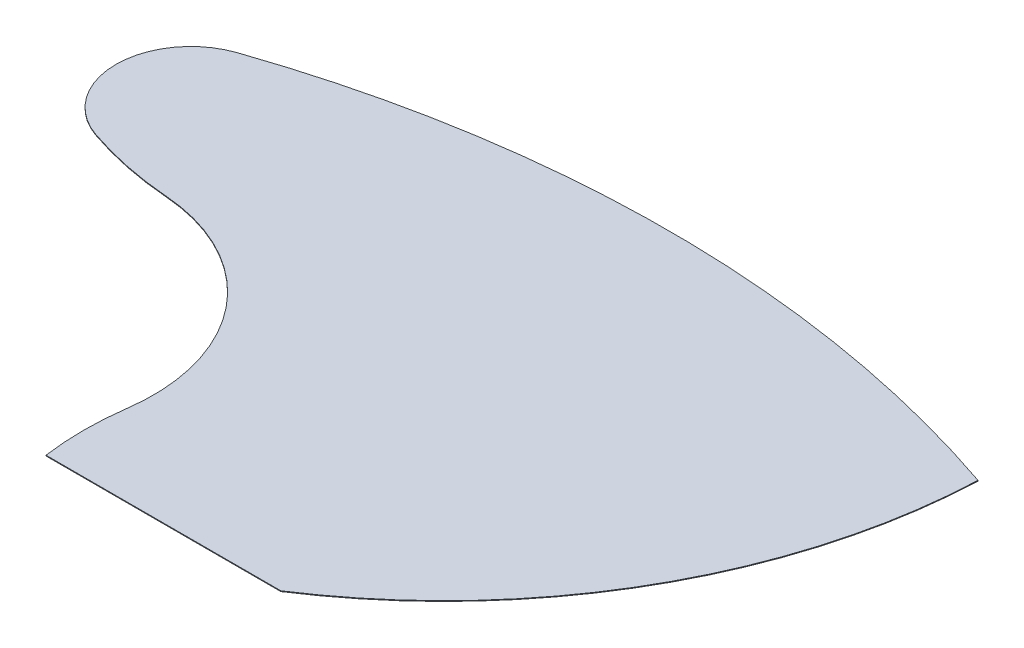
ISO-10303-21;
HEADER;
FILE_DESCRIPTION(('STEP AP214'),'2;1');
FILE_NAME('part.step','',(''),(''),'','','');
FILE_SCHEMA(('AUTOMOTIVE_DESIGN { 1 0 10303 214 1 1 1 1 }'));
ENDSEC;
DATA;
#1=APPLICATION_CONTEXT('core data for automotive mechanical design processes');
#2=APPLICATION_PROTOCOL_DEFINITION('international standard','automotive_design',2000,#1);
#3=PRODUCT_CONTEXT('',#1,'mechanical');
#4=PRODUCT('Part','Part','',(#3));
#5=PRODUCT_RELATED_PRODUCT_CATEGORY('part','',(#4));
#6=PRODUCT_DEFINITION_FORMATION('','',#4);
#7=PRODUCT_DEFINITION_CONTEXT('part definition',#1,'design');
#8=PRODUCT_DEFINITION('design','',#6,#7);
#9=PRODUCT_DEFINITION_SHAPE('','',#8);
#10=(LENGTH_UNIT() NAMED_UNIT(*) SI_UNIT(.MILLI.,.METRE.));
#11=(NAMED_UNIT(*) PLANE_ANGLE_UNIT() SI_UNIT($,.RADIAN.));
#12=(NAMED_UNIT(*) SI_UNIT($,.STERADIAN.) SOLID_ANGLE_UNIT());
#13=UNCERTAINTY_MEASURE_WITH_UNIT(LENGTH_MEASURE(1.E-05),#10,'distance_accuracy_value','');
#14=(GEOMETRIC_REPRESENTATION_CONTEXT(3) GLOBAL_UNCERTAINTY_ASSIGNED_CONTEXT((#13)) GLOBAL_UNIT_ASSIGNED_CONTEXT((#10,
#11,#12)) REPRESENTATION_CONTEXT('',''));
#15=CARTESIAN_POINT('',(0.,0.,0.));
#16=DIRECTION('',(0.,0.,1.));
#17=DIRECTION('',(1.,0.,0.));
#18=AXIS2_PLACEMENT_3D('',#15,#16,#17);
#19=CARTESIAN_POINT('',(158.730655830368,0.2,-18.2172793213948));
#20=DIRECTION('',(0.,-1.,0.));
#21=DIRECTION('',(0.,0.,-1.));
#22=AXIS2_PLACEMENT_3D('',#19,#20,#21);
#23=CYLINDRICAL_SURFACE('',#22,82.49);
#24=CARTESIAN_POINT('',(158.730655830368,0.,-18.2172793213948));
#25=DIRECTION('',(0.,1.,0.));
#26=DIRECTION('',(0.,0.,1.));
#27=AXIS2_PLACEMENT_3D('',#24,#25,#26);
#28=CIRCLE('',#27,82.49);
#29=CARTESIAN_POINT('',(77.0118111562556,0.,-29.4703022542895));
#30=VERTEX_POINT('',#29);
#31=CARTESIAN_POINT('',(77.0118111562556,0.,-6.96425638850026));
#32=VERTEX_POINT('',#31);
#33=EDGE_CURVE('E129',#30,#32,#28,.T.);
#34=ORIENTED_EDGE('',*,*,#33,.T.);
#35=DIRECTION('',(0.,-1.,0.));
#36=VECTOR('',#35,1.);
#37=CARTESIAN_POINT('',(77.0118111562556,0.2,-6.96425638850026));
#38=LINE('',#37,#36);
#39=CARTESIAN_POINT('',(77.0118111562556,0.2,-6.96425638850026));
#40=VERTEX_POINT('',#39);
#41=EDGE_CURVE('E11',#40,#32,#38,.T.);
#42=ORIENTED_EDGE('',*,*,#41,.F.);
#43=CARTESIAN_POINT('',(158.730655830368,0.2,-18.2172793213948));
#44=DIRECTION('',(0.,1.,0.));
#45=DIRECTION('',(0.,0.,1.));
#46=AXIS2_PLACEMENT_3D('',#43,#44,#45);
#47=CIRCLE('',#46,82.49);
#48=CARTESIAN_POINT('',(77.0118111562556,0.2,-29.4703022542895));
#49=VERTEX_POINT('',#48);
#50=EDGE_CURVE('E141',#49,#40,#47,.T.);
#51=ORIENTED_EDGE('',*,*,#50,.F.);
#52=DIRECTION('',(0.,-1.,0.));
#53=VECTOR('',#52,1.);
#54=CARTESIAN_POINT('',(77.0118111562556,0.2,-29.4703022542895));
#55=LINE('',#54,#53);
#56=EDGE_CURVE('E125',#49,#30,#55,.T.);
#57=ORIENTED_EDGE('',*,*,#56,.T.);
#58=EDGE_LOOP('',(#34,#42,#51,#57));
#59=FACE_BOUND('',#58,.T.);
#60=ADVANCED_FACE('F39',(#59),#23,.T.);
#61=CARTESIAN_POINT('',(77.0118111562556,0.2,-6.96425638850026));
#62=DIRECTION('',(0.,0.,-1.));
#63=DIRECTION('',(-1.,0.,0.));
#64=AXIS2_PLACEMENT_3D('',#61,#62,#63);
#65=PLANE('',#64);
#66=DIRECTION('',(1.,0.,0.));
#67=VECTOR('',#66,1.);
#68=CARTESIAN_POINT('',(77.0118111562556,0.,-6.96425638850026));
#69=LINE('',#68,#67);
#70=CARTESIAN_POINT('',(142.011811156256,0.,-6.96425638850026));
#71=VERTEX_POINT('',#70);
#72=EDGE_CURVE('E132',#32,#71,#69,.T.);
#73=ORIENTED_EDGE('',*,*,#72,.T.);
#74=DIRECTION('',(0.,-1.,0.));
#75=VECTOR('',#74,1.);
#76=CARTESIAN_POINT('',(142.011811156256,0.2,-6.96425638850026));
#77=LINE('',#76,#75);
#78=CARTESIAN_POINT('',(142.011811156256,0.2,-6.96425638850026));
#79=VERTEX_POINT('',#78);
#80=EDGE_CURVE('E47',#79,#71,#77,.T.);
#81=ORIENTED_EDGE('',*,*,#80,.F.);
#82=DIRECTION('',(1.,0.,0.));
#83=VECTOR('',#82,1.);
#84=CARTESIAN_POINT('',(77.0118111562556,0.2,-6.96425638850026));
#85=LINE('',#84,#83);
#86=EDGE_CURVE('E95',#40,#79,#85,.T.);
#87=ORIENTED_EDGE('',*,*,#86,.F.);
#88=ORIENTED_EDGE('',*,*,#41,.T.);
#89=EDGE_LOOP('',(#73,#81,#87,#88));
#90=FACE_BOUND('',#89,.T.);
#91=ADVANCED_FACE('F166',(#90),#65,.F.);
#92=CARTESIAN_POINT('',(57.9997865278131,0.2,-136.197066919843));
#93=DIRECTION('',(0.,-1.,0.));
#94=DIRECTION('',(0.,0.,-1.));
#95=AXIS2_PLACEMENT_3D('',#92,#93,#94);
#96=CYLINDRICAL_SURFACE('',#95,154.14);
#97=CARTESIAN_POINT('',(57.9997865278131,0.,-136.197066919843));
#98=DIRECTION('',(0.,1.,0.));
#99=DIRECTION('',(0.,0.,1.));
#100=AXIS2_PLACEMENT_3D('',#97,#98,#99);
#101=CIRCLE('',#100,154.14);
#102=CARTESIAN_POINT('',(212.011811156255,0.,-129.917268368291));
#103=VERTEX_POINT('',#102);
#104=EDGE_CURVE('E134',#71,#103,#101,.T.);
#105=ORIENTED_EDGE('',*,*,#104,.T.);
#106=DIRECTION('',(0.,-1.,0.));
#107=VECTOR('',#106,1.);
#108=CARTESIAN_POINT('',(212.011811156255,0.2,-129.917268368291));
#109=LINE('',#108,#107);
#110=CARTESIAN_POINT('',(212.011811156255,0.2,-129.917268368291));
#111=VERTEX_POINT('',#110);
#112=EDGE_CURVE('E145',#111,#103,#109,.T.);
#113=ORIENTED_EDGE('',*,*,#112,.F.);
#114=CARTESIAN_POINT('',(57.9997865278131,0.2,-136.197066919843));
#115=DIRECTION('',(0.,1.,0.));
#116=DIRECTION('',(0.,0.,1.));
#117=AXIS2_PLACEMENT_3D('',#114,#115,#116);
#118=CIRCLE('',#117,154.14);
#119=EDGE_CURVE('E153',#79,#111,#118,.T.);
#120=ORIENTED_EDGE('',*,*,#119,.F.);
#121=ORIENTED_EDGE('',*,*,#80,.T.);
#122=EDGE_LOOP('',(#105,#113,#120,#121));
#123=FACE_BOUND('',#122,.T.);
#124=ADVANCED_FACE('F151',(#123),#96,.T.);
#125=CARTESIAN_POINT('',(109.511811156256,0.2,169.714848089125));
#126=DIRECTION('',(0.,-1.,0.));
#127=DIRECTION('',(0.,0.,-1.));
#128=AXIS2_PLACEMENT_3D('',#125,#126,#127);
#129=CYLINDRICAL_SURFACE('',#128,316.679104477624);
#130=CARTESIAN_POINT('',(109.511811156256,0.,169.714848089125));
#131=DIRECTION('',(0.,1.,0.));
#132=DIRECTION('',(0.,0.,-1.));
#133=AXIS2_PLACEMENT_3D('',#130,#131,#132);
#134=CIRCLE('',#133,316.679104477624);
#135=CARTESIAN_POINT('',(7.01181115625533,0.,-129.91726836829));
#136=VERTEX_POINT('',#135);
#137=EDGE_CURVE('E136',#103,#136,#134,.T.);
#138=ORIENTED_EDGE('',*,*,#137,.T.);
#139=DIRECTION('',(0.,-1.,0.));
#140=VECTOR('',#139,1.);
#141=CARTESIAN_POINT('',(7.01181115625533,0.2,-129.91726836829));
#142=LINE('',#141,#140);
#143=CARTESIAN_POINT('',(7.01181115625533,0.2,-129.91726836829));
#144=VERTEX_POINT('',#143);
#145=EDGE_CURVE('E120',#144,#136,#142,.T.);
#146=ORIENTED_EDGE('',*,*,#145,.F.);
#147=CARTESIAN_POINT('',(109.511811156256,0.2,169.714848089125));
#148=DIRECTION('',(0.,1.,0.));
#149=DIRECTION('',(0.,0.,-1.));
#150=AXIS2_PLACEMENT_3D('',#147,#148,#149);
#151=CIRCLE('',#150,316.679104477624);
#152=EDGE_CURVE('E111',#111,#144,#151,.T.);
#153=ORIENTED_EDGE('',*,*,#152,.F.);
#154=ORIENTED_EDGE('',*,*,#112,.T.);
#155=EDGE_LOOP('',(#138,#146,#153,#154));
#156=FACE_BOUND('',#155,.T.);
#157=ADVANCED_FACE('F159',(#156),#129,.T.);
#158=CARTESIAN_POINT('',(13.7118111562555,0.2,-110.331559292538));
#159=DIRECTION('',(0.,-1.,0.));
#160=DIRECTION('',(0.,0.,-1.));
#161=AXIS2_PLACEMENT_3D('',#158,#159,#160);
#162=CYLINDRICAL_SURFACE('',#161,20.7);
#163=CARTESIAN_POINT('',(13.7118111562555,0.,-110.331559292538));
#164=DIRECTION('',(0.,1.,0.));
#165=DIRECTION('',(0.,0.,1.));
#166=AXIS2_PLACEMENT_3D('',#163,#164,#165);
#167=CIRCLE('',#166,20.7);
#168=CARTESIAN_POINT('',(7.01181115625551,0.,-90.7458502167862));
#169=VERTEX_POINT('',#168);
#170=EDGE_CURVE('E119',#136,#169,#167,.T.);
#171=ORIENTED_EDGE('',*,*,#170,.T.);
#172=DIRECTION('',(0.,-1.,0.));
#173=VECTOR('',#172,1.);
#174=CARTESIAN_POINT('',(7.01181115625551,0.2,-90.7458502167862));
#175=LINE('',#174,#173);
#176=CARTESIAN_POINT('',(7.01181115625551,0.2,-90.7458502167862));
#177=VERTEX_POINT('',#176);
#178=EDGE_CURVE('E116',#177,#169,#175,.T.);
#179=ORIENTED_EDGE('',*,*,#178,.F.);
#180=CARTESIAN_POINT('',(13.7118111562555,0.2,-110.331559292538));
#181=DIRECTION('',(0.,1.,0.));
#182=DIRECTION('',(0.,0.,1.));
#183=AXIS2_PLACEMENT_3D('',#180,#181,#182);
#184=CIRCLE('',#183,20.7);
#185=EDGE_CURVE('E105',#144,#177,#184,.T.);
#186=ORIENTED_EDGE('',*,*,#185,.F.);
#187=ORIENTED_EDGE('',*,*,#145,.T.);
#188=EDGE_LOOP('',(#171,#179,#186,#187));
#189=FACE_BOUND('',#188,.T.);
#190=ADVANCED_FACE('F117',(#189),#162,.T.);
#191=CARTESIAN_POINT('',(39.2818594654343,0.2,-185.07895141739));
#192=DIRECTION('',(0.,-1.,0.));
#193=DIRECTION('',(0.,0.,-1.));
#194=AXIS2_PLACEMENT_3D('',#191,#192,#193);
#195=CYLINDRICAL_SURFACE('',#194,99.6999999999995);
#196=CARTESIAN_POINT('',(39.2818594654343,0.,-185.07895141739));
#197=DIRECTION('',(0.,1.,0.));
#198=DIRECTION('',(0.,0.,1.));
#199=AXIS2_PLACEMENT_3D('',#196,#197,#198);
#200=CIRCLE('',#199,99.6999999999995);
#201=CARTESIAN_POINT('',(31.6770956043986,0.,-85.6694067719291));
#202=VERTEX_POINT('',#201);
#203=EDGE_CURVE('E81',#169,#202,#200,.T.);
#204=ORIENTED_EDGE('',*,*,#203,.T.);
#205=DIRECTION('',(0.,-1.,0.));
#206=VECTOR('',#205,1.);
#207=CARTESIAN_POINT('',(31.6770956043986,0.2,-85.6694067719291));
#208=LINE('',#207,#206);
#209=CARTESIAN_POINT('',(31.6770956043986,0.2,-85.6694067719291));
#210=VERTEX_POINT('',#209);
#211=EDGE_CURVE('E121',#210,#202,#208,.T.);
#212=ORIENTED_EDGE('',*,*,#211,.F.);
#213=CARTESIAN_POINT('',(39.2818594654343,0.2,-185.07895141739));
#214=DIRECTION('',(0.,1.,0.));
#215=DIRECTION('',(0.,0.,1.));
#216=AXIS2_PLACEMENT_3D('',#213,#214,#215);
#217=CIRCLE('',#216,99.6999999999995);
#218=EDGE_CURVE('E109',#177,#210,#217,.T.);
#219=ORIENTED_EDGE('',*,*,#218,.F.);
#220=ORIENTED_EDGE('',*,*,#178,.T.);
#221=EDGE_LOOP('',(#204,#212,#219,#220));
#222=FACE_BOUND('',#221,.T.);
#223=ADVANCED_FACE('F123',(#222),#195,.T.);
#224=CARTESIAN_POINT('',(27.8953083202452,0.2,-36.2338478599741));
#225=DIRECTION('',(0.,-1.,0.));
#226=DIRECTION('',(0.,0.,-1.));
#227=AXIS2_PLACEMENT_3D('',#224,#225,#226);
#228=CYLINDRICAL_SURFACE('',#227,49.58);
#229=CARTESIAN_POINT('',(27.8953083202452,0.,-36.2338478599741));
#230=DIRECTION('',(0.,-1.,0.));
#231=DIRECTION('',(0.,0.,1.));
#232=AXIS2_PLACEMENT_3D('',#229,#230,#231);
#233=CIRCLE('',#232,49.58);
#234=EDGE_CURVE('E87',#202,#30,#233,.T.);
#235=ORIENTED_EDGE('',*,*,#234,.T.);
#236=ORIENTED_EDGE('',*,*,#56,.F.);
#237=CARTESIAN_POINT('',(27.8953083202452,0.2,-36.2338478599741));
#238=DIRECTION('',(0.,-1.,0.));
#239=DIRECTION('',(0.,0.,1.));
#240=AXIS2_PLACEMENT_3D('',#237,#238,#239);
#241=CIRCLE('',#240,49.58);
#242=EDGE_CURVE('E55',#210,#49,#241,.T.);
#243=ORIENTED_EDGE('',*,*,#242,.F.);
#244=ORIENTED_EDGE('',*,*,#211,.T.);
#245=EDGE_LOOP('',(#235,#236,#243,#244));
#246=FACE_BOUND('',#245,.T.);
#247=ADVANCED_FACE('F180',(#246),#228,.F.);
#248=CARTESIAN_POINT('',(158.730655830368,0.2,-18.2172793213948));
#249=DIRECTION('',(0.,1.,0.));
#250=DIRECTION('',(0.,0.,1.));
#251=AXIS2_PLACEMENT_3D('',#248,#249,#250);
#252=PLANE('',#251);
#253=ORIENTED_EDGE('',*,*,#50,.T.);
#254=ORIENTED_EDGE('',*,*,#86,.T.);
#255=ORIENTED_EDGE('',*,*,#119,.T.);
#256=ORIENTED_EDGE('',*,*,#152,.T.);
#257=ORIENTED_EDGE('',*,*,#185,.T.);
#258=ORIENTED_EDGE('',*,*,#218,.T.);
#259=ORIENTED_EDGE('',*,*,#242,.T.);
#260=EDGE_LOOP('',(#253,#254,#255,#256,#257,#258,#259));
#261=FACE_BOUND('',#260,.T.);
#262=ADVANCED_FACE('F107',(#261),#252,.T.);
#263=CARTESIAN_POINT('',(158.730655830368,0.,-18.2172793213948));
#264=DIRECTION('',(0.,1.,0.));
#265=DIRECTION('',(0.,0.,1.));
#266=AXIS2_PLACEMENT_3D('',#263,#264,#265);
#267=PLANE('',#266);
#268=ORIENTED_EDGE('',*,*,#33,.F.);
#269=ORIENTED_EDGE('',*,*,#234,.F.);
#270=ORIENTED_EDGE('',*,*,#203,.F.);
#271=ORIENTED_EDGE('',*,*,#170,.F.);
#272=ORIENTED_EDGE('',*,*,#137,.F.);
#273=ORIENTED_EDGE('',*,*,#104,.F.);
#274=ORIENTED_EDGE('',*,*,#72,.F.);
#275=EDGE_LOOP('',(#268,#269,#270,#271,#272,#273,#274));
#276=FACE_BOUND('',#275,.T.);
#277=ADVANCED_FACE('F157',(#276),#267,.F.);
#278=CLOSED_SHELL('',(#60,#91,#124,#157,#190,#223,#247,#262,#277));
#279=MANIFOLD_SOLID_BREP('B2',#278);
#280=ADVANCED_BREP_SHAPE_REPRESENTATION('',(#18,#279),#14);
#281=SHAPE_DEFINITION_REPRESENTATION(#9,#280);
ENDSEC;
END-ISO-10303-21;
